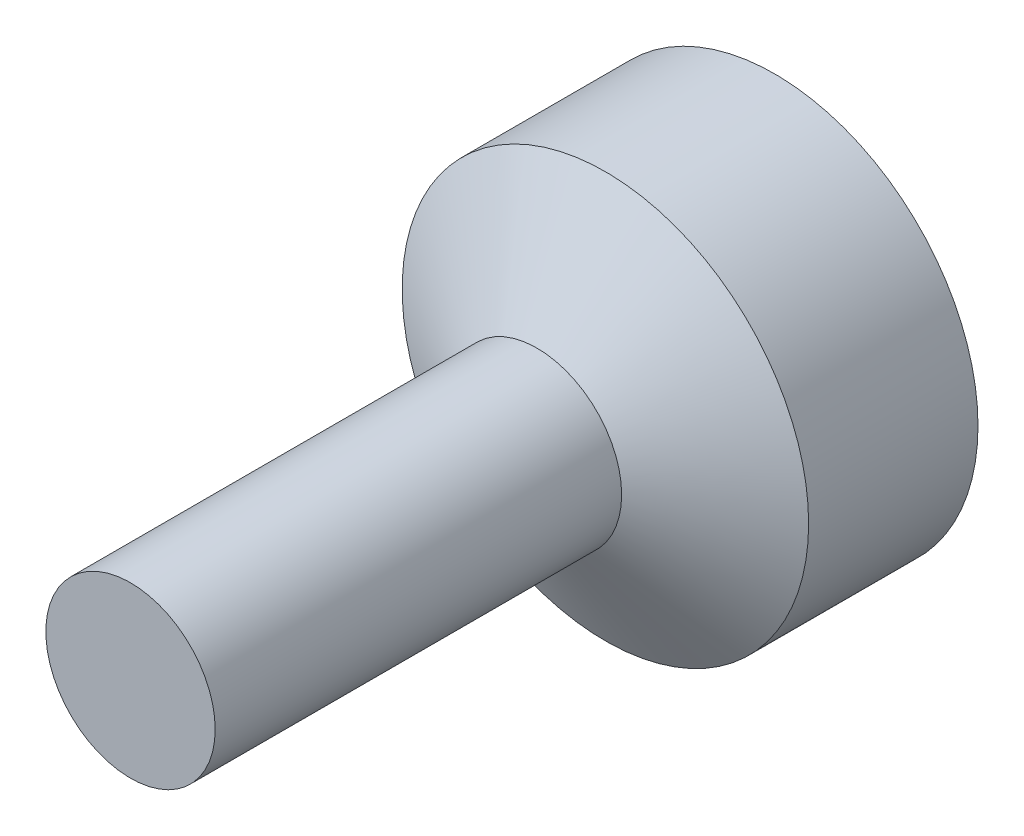
ISO-10303-21;
HEADER;
FILE_DESCRIPTION(('STEP AP214'),'2;1');
FILE_NAME('part.step','',(''),(''),'','','');
FILE_SCHEMA(('AUTOMOTIVE_DESIGN { 1 0 10303 214 1 1 1 1 }'));
ENDSEC;
DATA;
#1=APPLICATION_CONTEXT('core data for automotive mechanical design processes');
#2=APPLICATION_PROTOCOL_DEFINITION('international standard','automotive_design',2000,#1);
#3=PRODUCT_CONTEXT('',#1,'mechanical');
#4=PRODUCT('Part','Part','',(#3));
#5=PRODUCT_RELATED_PRODUCT_CATEGORY('part','',(#4));
#6=PRODUCT_DEFINITION_FORMATION('','',#4);
#7=PRODUCT_DEFINITION_CONTEXT('part definition',#1,'design');
#8=PRODUCT_DEFINITION('design','',#6,#7);
#9=PRODUCT_DEFINITION_SHAPE('','',#8);
#10=(LENGTH_UNIT() NAMED_UNIT(*) SI_UNIT(.MILLI.,.METRE.));
#11=(NAMED_UNIT(*) PLANE_ANGLE_UNIT() SI_UNIT($,.RADIAN.));
#12=(NAMED_UNIT(*) SI_UNIT($,.STERADIAN.) SOLID_ANGLE_UNIT());
#13=UNCERTAINTY_MEASURE_WITH_UNIT(LENGTH_MEASURE(1.E-05),#10,'distance_accuracy_value','');
#14=(GEOMETRIC_REPRESENTATION_CONTEXT(3) GLOBAL_UNCERTAINTY_ASSIGNED_CONTEXT((#13)) GLOBAL_UNIT_ASSIGNED_CONTEXT((#10,
#11,#12)) REPRESENTATION_CONTEXT('',''));
#15=CARTESIAN_POINT('',(0.,0.,0.));
#16=DIRECTION('',(0.,0.,1.));
#17=DIRECTION('',(1.,0.,0.));
#18=AXIS2_PLACEMENT_3D('',#15,#16,#17);
#19=CARTESIAN_POINT('',(0.,0.,0.));
#20=DIRECTION('',(0.,0.,-1.));
#21=DIRECTION('',(-1.,0.,0.));
#22=AXIS2_PLACEMENT_3D('',#19,#20,#21);
#23=PLANE('',#22);
#24=CARTESIAN_POINT('',(0.,0.,0.));
#25=DIRECTION('',(0.,0.,1.));
#26=DIRECTION('',(1.,0.,0.));
#27=AXIS2_PLACEMENT_3D('',#24,#25,#26);
#28=CIRCLE('',#27,3.048);
#29=CARTESIAN_POINT('',(3.048,0.,0.));
#30=VERTEX_POINT('',#29);
#31=EDGE_CURVE('E10',#30,#30,#28,.T.);
#32=ORIENTED_EDGE('',*,*,#31,.F.);
#33=EDGE_LOOP('',(#32));
#34=FACE_BOUND('',#33,.T.);
#35=ADVANCED_FACE('F31',(#34),#23,.T.);
#36=CARTESIAN_POINT('',(0.,0.,9.66252877861915));
#37=DIRECTION('',(0.,0.,1.));
#38=DIRECTION('',(1.,0.,0.));
#39=AXIS2_PLACEMENT_3D('',#36,#37,#38);
#40=CYLINDRICAL_SURFACE('',#39,3.048);
#41=ORIENTED_EDGE('',*,*,#31,.T.);
#42=EDGE_LOOP('',(#41));
#43=FACE_BOUND('',#42,.T.);
#44=CARTESIAN_POINT('',(0.,0.,2.54));
#45=DIRECTION('',(0.,0.,1.));
#46=DIRECTION('',(1.,0.,0.));
#47=AXIS2_PLACEMENT_3D('',#44,#45,#46);
#48=CIRCLE('',#47,3.048);
#49=CARTESIAN_POINT('',(3.048,0.,2.54));
#50=VERTEX_POINT('',#49);
#51=EDGE_CURVE('E37',#50,#50,#48,.T.);
#52=ORIENTED_EDGE('',*,*,#51,.F.);
#53=EDGE_LOOP('',(#52));
#54=FACE_BOUND('',#53,.T.);
#55=ADVANCED_FACE('F63',(#43,#54),#40,.T.);
#56=CARTESIAN_POINT('',(0.,0.,3.56652877861915));
#57=DIRECTION('',(0.,0.,-1.));
#58=DIRECTION('',(-1.,0.,0.));
#59=AXIS2_PLACEMENT_3D('',#56,#57,#58);
#60=CONICAL_SURFACE('',#59,1.27,1.0471975511966);
#61=ORIENTED_EDGE('',*,*,#51,.T.);
#62=EDGE_LOOP('',(#61));
#63=FACE_BOUND('',#62,.T.);
#64=CARTESIAN_POINT('',(0.,0.,3.56652877861915));
#65=DIRECTION('',(0.,0.,1.));
#66=DIRECTION('',(1.,0.,0.));
#67=AXIS2_PLACEMENT_3D('',#64,#65,#66);
#68=CIRCLE('',#67,1.27);
#69=CARTESIAN_POINT('',(1.27,0.,3.56652877861915));
#70=VERTEX_POINT('',#69);
#71=EDGE_CURVE('E41',#70,#70,#68,.T.);
#72=ORIENTED_EDGE('',*,*,#71,.F.);
#73=EDGE_LOOP('',(#72));
#74=FACE_BOUND('',#73,.T.);
#75=ADVANCED_FACE('F55',(#63,#74),#60,.T.);
#76=CARTESIAN_POINT('',(0.,0.,9.66252877861915));
#77=DIRECTION('',(0.,0.,1.));
#78=DIRECTION('',(1.,0.,0.));
#79=AXIS2_PLACEMENT_3D('',#76,#77,#78);
#80=CYLINDRICAL_SURFACE('',#79,1.27);
#81=ORIENTED_EDGE('',*,*,#71,.T.);
#82=EDGE_LOOP('',(#81));
#83=FACE_BOUND('',#82,.T.);
#84=CARTESIAN_POINT('',(0.,0.,9.66252877861915));
#85=DIRECTION('',(0.,0.,1.));
#86=DIRECTION('',(1.,0.,0.));
#87=AXIS2_PLACEMENT_3D('',#84,#85,#86);
#88=CIRCLE('',#87,1.27);
#89=CARTESIAN_POINT('',(1.27,0.,9.66252877861915));
#90=VERTEX_POINT('',#89);
#91=EDGE_CURVE('E45',#90,#90,#88,.T.);
#92=ORIENTED_EDGE('',*,*,#91,.F.);
#93=EDGE_LOOP('',(#92));
#94=FACE_BOUND('',#93,.T.);
#95=ADVANCED_FACE('F53',(#83,#94),#80,.T.);
#96=CARTESIAN_POINT('',(1.27,0.,9.66252877861915));
#97=DIRECTION('',(0.,0.,1.));
#98=DIRECTION('',(1.,0.,0.));
#99=AXIS2_PLACEMENT_3D('',#96,#97,#98);
#100=PLANE('',#99);
#101=ORIENTED_EDGE('',*,*,#91,.T.);
#102=EDGE_LOOP('',(#101));
#103=FACE_BOUND('',#102,.T.);
#104=ADVANCED_FACE('F51',(#103),#100,.T.);
#105=CLOSED_SHELL('',(#35,#55,#75,#95,#104));
#106=MANIFOLD_SOLID_BREP('B2',#105);
#107=ADVANCED_BREP_SHAPE_REPRESENTATION('',(#18,#106),#14);
#108=SHAPE_DEFINITION_REPRESENTATION(#9,#107);
ENDSEC;
END-ISO-10303-21;
